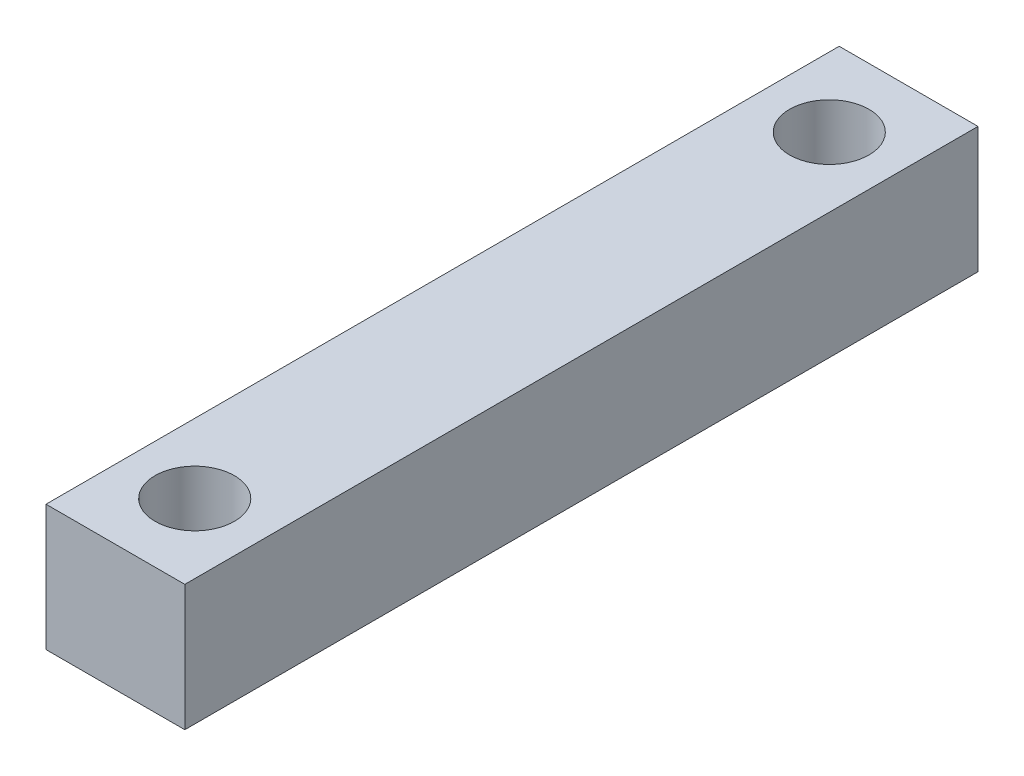
ISO-10303-21;
HEADER;
FILE_DESCRIPTION(('STEP AP214'),'2;1');
FILE_NAME('part.step','',(''),(''),'','','');
FILE_SCHEMA(('AUTOMOTIVE_DESIGN { 1 0 10303 214 1 1 1 1 }'));
ENDSEC;
DATA;
#1=APPLICATION_CONTEXT('core data for automotive mechanical design processes');
#2=APPLICATION_PROTOCOL_DEFINITION('international standard','automotive_design',2000,#1);
#3=PRODUCT_CONTEXT('',#1,'mechanical');
#4=PRODUCT('Part','Part','',(#3));
#5=PRODUCT_RELATED_PRODUCT_CATEGORY('part','',(#4));
#6=PRODUCT_DEFINITION_FORMATION('','',#4);
#7=PRODUCT_DEFINITION_CONTEXT('part definition',#1,'design');
#8=PRODUCT_DEFINITION('design','',#6,#7);
#9=PRODUCT_DEFINITION_SHAPE('','',#8);
#10=(LENGTH_UNIT() NAMED_UNIT(*) SI_UNIT(.MILLI.,.METRE.));
#11=(NAMED_UNIT(*) PLANE_ANGLE_UNIT() SI_UNIT($,.RADIAN.));
#12=(NAMED_UNIT(*) SI_UNIT($,.STERADIAN.) SOLID_ANGLE_UNIT());
#13=UNCERTAINTY_MEASURE_WITH_UNIT(LENGTH_MEASURE(1.E-05),#10,'distance_accuracy_value','');
#14=(GEOMETRIC_REPRESENTATION_CONTEXT(3) GLOBAL_UNCERTAINTY_ASSIGNED_CONTEXT((#13)) GLOBAL_UNIT_ASSIGNED_CONTEXT((#10,
#11,#12)) REPRESENTATION_CONTEXT('',''));
#15=CARTESIAN_POINT('',(0.,0.,0.));
#16=DIRECTION('',(0.,0.,1.));
#17=DIRECTION('',(1.,0.,0.));
#18=AXIS2_PLACEMENT_3D('',#15,#16,#17);
#19=CARTESIAN_POINT('',(3.5,3.175,-20.));
#20=DIRECTION('',(-1.,0.,0.));
#21=DIRECTION('',(0.,0.,1.));
#22=AXIS2_PLACEMENT_3D('',#19,#20,#21);
#23=PLANE('',#22);
#24=DIRECTION('',(0.,0.,-1.));
#25=VECTOR('',#24,1.);
#26=CARTESIAN_POINT('',(3.5,0.,-20.));
#27=LINE('',#26,#25);
#28=CARTESIAN_POINT('',(3.5,0.,20.));
#29=VERTEX_POINT('',#28);
#30=CARTESIAN_POINT('',(3.5,0.,-20.));
#31=VERTEX_POINT('',#30);
#32=EDGE_CURVE('E100',#29,#31,#27,.T.);
#33=ORIENTED_EDGE('',*,*,#32,.T.);
#34=DIRECTION('',(0.,-1.,0.));
#35=VECTOR('',#34,1.);
#36=CARTESIAN_POINT('',(3.5,3.175,-20.));
#37=LINE('',#36,#35);
#38=CARTESIAN_POINT('',(3.5,6.35,-20.));
#39=VERTEX_POINT('',#38);
#40=EDGE_CURVE('E11',#39,#31,#37,.T.);
#41=ORIENTED_EDGE('',*,*,#40,.F.);
#42=DIRECTION('',(0.,0.,-1.));
#43=VECTOR('',#42,1.);
#44=CARTESIAN_POINT('',(3.5,6.35,-20.));
#45=LINE('',#44,#43);
#46=CARTESIAN_POINT('',(3.5,6.35,20.));
#47=VERTEX_POINT('',#46);
#48=EDGE_CURVE('E84',#47,#39,#45,.T.);
#49=ORIENTED_EDGE('',*,*,#48,.F.);
#50=DIRECTION('',(0.,-1.,0.));
#51=VECTOR('',#50,1.);
#52=CARTESIAN_POINT('',(3.5,3.175,20.));
#53=LINE('',#52,#51);
#54=EDGE_CURVE('E76',#47,#29,#53,.T.);
#55=ORIENTED_EDGE('',*,*,#54,.T.);
#56=EDGE_LOOP('',(#33,#41,#49,#55));
#57=FACE_BOUND('',#56,.T.);
#58=ADVANCED_FACE('F32',(#57),#23,.F.);
#59=CARTESIAN_POINT('',(-3.5,3.175,-20.));
#60=DIRECTION('',(0.,0.,1.));
#61=DIRECTION('',(1.,0.,0.));
#62=AXIS2_PLACEMENT_3D('',#59,#60,#61);
#63=PLANE('',#62);
#64=DIRECTION('',(-1.,0.,0.));
#65=VECTOR('',#64,1.);
#66=CARTESIAN_POINT('',(-3.5,0.,-20.));
#67=LINE('',#66,#65);
#68=CARTESIAN_POINT('',(-3.5,0.,-20.));
#69=VERTEX_POINT('',#68);
#70=EDGE_CURVE('E103',#31,#69,#67,.T.);
#71=ORIENTED_EDGE('',*,*,#70,.T.);
#72=DIRECTION('',(0.,-1.,0.));
#73=VECTOR('',#72,1.);
#74=CARTESIAN_POINT('',(-3.5,3.175,-20.));
#75=LINE('',#74,#73);
#76=CARTESIAN_POINT('',(-3.5,6.35,-20.));
#77=VERTEX_POINT('',#76);
#78=EDGE_CURVE('E39',#77,#69,#75,.T.);
#79=ORIENTED_EDGE('',*,*,#78,.F.);
#80=DIRECTION('',(-1.,0.,0.));
#81=VECTOR('',#80,1.);
#82=CARTESIAN_POINT('',(-3.5,6.35,-20.));
#83=LINE('',#82,#81);
#84=EDGE_CURVE('E90',#39,#77,#83,.T.);
#85=ORIENTED_EDGE('',*,*,#84,.F.);
#86=ORIENTED_EDGE('',*,*,#40,.T.);
#87=EDGE_LOOP('',(#71,#79,#85,#86));
#88=FACE_BOUND('',#87,.T.);
#89=ADVANCED_FACE('F112',(#88),#63,.F.);
#90=CARTESIAN_POINT('',(-3.5,3.175,-20.));
#91=DIRECTION('',(1.,0.,0.));
#92=DIRECTION('',(0.,0.,-1.));
#93=AXIS2_PLACEMENT_3D('',#90,#91,#92);
#94=PLANE('',#93);
#95=DIRECTION('',(0.,0.,1.));
#96=VECTOR('',#95,1.);
#97=CARTESIAN_POINT('',(-3.5,0.,-20.));
#98=LINE('',#97,#96);
#99=CARTESIAN_POINT('',(-3.5,0.,20.));
#100=VERTEX_POINT('',#99);
#101=EDGE_CURVE('E54',#69,#100,#98,.T.);
#102=ORIENTED_EDGE('',*,*,#101,.T.);
#103=DIRECTION('',(0.,-1.,0.));
#104=VECTOR('',#103,1.);
#105=CARTESIAN_POINT('',(-3.5,3.175,20.));
#106=LINE('',#105,#104);
#107=CARTESIAN_POINT('',(-3.5,6.35,20.));
#108=VERTEX_POINT('',#107);
#109=EDGE_CURVE('E71',#108,#100,#106,.T.);
#110=ORIENTED_EDGE('',*,*,#109,.F.);
#111=DIRECTION('',(0.,0.,1.));
#112=VECTOR('',#111,1.);
#113=CARTESIAN_POINT('',(-3.5,6.35,-20.));
#114=LINE('',#113,#112);
#115=EDGE_CURVE('E75',#77,#108,#114,.T.);
#116=ORIENTED_EDGE('',*,*,#115,.F.);
#117=ORIENTED_EDGE('',*,*,#78,.T.);
#118=EDGE_LOOP('',(#102,#110,#116,#117));
#119=FACE_BOUND('',#118,.T.);
#120=ADVANCED_FACE('F73',(#119),#94,.F.);
#121=CARTESIAN_POINT('',(-3.5,3.175,20.));
#122=DIRECTION('',(0.,0.,-1.));
#123=DIRECTION('',(-1.,0.,0.));
#124=AXIS2_PLACEMENT_3D('',#121,#122,#123);
#125=PLANE('',#124);
#126=DIRECTION('',(1.,0.,0.));
#127=VECTOR('',#126,1.);
#128=CARTESIAN_POINT('',(-3.5,0.,20.));
#129=LINE('',#128,#127);
#130=EDGE_CURVE('E46',#100,#29,#129,.T.);
#131=ORIENTED_EDGE('',*,*,#130,.T.);
#132=ORIENTED_EDGE('',*,*,#54,.F.);
#133=DIRECTION('',(1.,0.,0.));
#134=VECTOR('',#133,1.);
#135=CARTESIAN_POINT('',(-3.5,6.35,20.));
#136=LINE('',#135,#134);
#137=EDGE_CURVE('E79',#108,#47,#136,.T.);
#138=ORIENTED_EDGE('',*,*,#137,.F.);
#139=ORIENTED_EDGE('',*,*,#109,.T.);
#140=EDGE_LOOP('',(#131,#132,#138,#139));
#141=FACE_BOUND('',#140,.T.);
#142=ADVANCED_FACE('F80',(#141),#125,.F.);
#143=CARTESIAN_POINT('',(0.,0.,0.));
#144=DIRECTION('',(0.,1.,0.));
#145=DIRECTION('',(0.,0.,1.));
#146=AXIS2_PLACEMENT_3D('',#143,#144,#145);
#147=PLANE('',#146);
#148=ORIENTED_EDGE('',*,*,#32,.F.);
#149=ORIENTED_EDGE('',*,*,#130,.F.);
#150=ORIENTED_EDGE('',*,*,#101,.F.);
#151=ORIENTED_EDGE('',*,*,#70,.F.);
#152=EDGE_LOOP('',(#148,#149,#150,#151));
#153=FACE_BOUND('',#152,.T.);
#154=ADVANCED_FACE('F110',(#153),#147,.F.);
#155=CARTESIAN_POINT('',(0.,6.35,0.));
#156=DIRECTION('',(0.,1.,0.));
#157=DIRECTION('',(0.,0.,1.));
#158=AXIS2_PLACEMENT_3D('',#155,#156,#157);
#159=PLANE('',#158);
#160=CARTESIAN_POINT('',(0.,6.35,-16.));
#161=DIRECTION('',(0.,1.,0.));
#162=DIRECTION('',(0.,0.,1.));
#163=AXIS2_PLACEMENT_3D('',#160,#161,#162);
#164=CIRCLE('',#163,2.);
#165=CARTESIAN_POINT('',(0.,6.35,-14.));
#166=VERTEX_POINT('',#165);
#167=EDGE_CURVE('E91',#166,#166,#164,.T.);
#168=ORIENTED_EDGE('',*,*,#167,.F.);
#169=EDGE_LOOP('',(#168));
#170=FACE_BOUND('',#169,.T.);
#171=ORIENTED_EDGE('',*,*,#115,.T.);
#172=ORIENTED_EDGE('',*,*,#137,.T.);
#173=ORIENTED_EDGE('',*,*,#48,.T.);
#174=ORIENTED_EDGE('',*,*,#84,.T.);
#175=EDGE_LOOP('',(#171,#172,#173,#174));
#176=FACE_BOUND('',#175,.T.);
#177=CARTESIAN_POINT('',(0.,6.35,16.));
#178=DIRECTION('',(0.,1.,0.));
#179=DIRECTION('',(0.,0.,1.));
#180=AXIS2_PLACEMENT_3D('',#177,#178,#179);
#181=CIRCLE('',#180,2.);
#182=CARTESIAN_POINT('',(0.,6.35,18.));
#183=VERTEX_POINT('',#182);
#184=EDGE_CURVE('E144',#183,#183,#181,.T.);
#185=ORIENTED_EDGE('',*,*,#184,.F.);
#186=EDGE_LOOP('',(#185));
#187=FACE_BOUND('',#186,.T.);
#188=ADVANCED_FACE('F87',(#170,#176,#187),#159,.T.);
#189=CARTESIAN_POINT('',(0.,6.35,-16.));
#190=DIRECTION('',(0.,-1.,0.));
#191=DIRECTION('',(0.,0.,-1.));
#192=AXIS2_PLACEMENT_3D('',#189,#190,#191);
#193=CYLINDRICAL_SURFACE('',#192,2.);
#194=ORIENTED_EDGE('',*,*,#167,.T.);
#195=EDGE_LOOP('',(#194));
#196=FACE_BOUND('',#195,.T.);
#197=CARTESIAN_POINT('',(0.,3.175,-16.));
#198=DIRECTION('',(0.,1.,0.));
#199=DIRECTION('',(0.,0.,1.));
#200=AXIS2_PLACEMENT_3D('',#197,#198,#199);
#201=CIRCLE('',#200,2.);
#202=CARTESIAN_POINT('',(0.,3.175,-14.));
#203=VERTEX_POINT('',#202);
#204=EDGE_CURVE('E94',#203,#203,#201,.T.);
#205=ORIENTED_EDGE('',*,*,#204,.F.);
#206=EDGE_LOOP('',(#205));
#207=FACE_BOUND('',#206,.T.);
#208=ADVANCED_FACE('F132',(#196,#207),#193,.F.);
#209=CARTESIAN_POINT('',(0.,6.35,16.));
#210=DIRECTION('',(0.,-1.,0.));
#211=DIRECTION('',(0.,0.,-1.));
#212=AXIS2_PLACEMENT_3D('',#209,#210,#211);
#213=CYLINDRICAL_SURFACE('',#212,2.);
#214=ORIENTED_EDGE('',*,*,#184,.T.);
#215=EDGE_LOOP('',(#214));
#216=FACE_BOUND('',#215,.T.);
#217=CARTESIAN_POINT('',(0.,3.175,16.));
#218=DIRECTION('',(0.,1.,0.));
#219=DIRECTION('',(0.,0.,1.));
#220=AXIS2_PLACEMENT_3D('',#217,#218,#219);
#221=CIRCLE('',#220,2.);
#222=CARTESIAN_POINT('',(0.,3.175,18.));
#223=VERTEX_POINT('',#222);
#224=EDGE_CURVE('E147',#223,#223,#221,.T.);
#225=ORIENTED_EDGE('',*,*,#224,.F.);
#226=EDGE_LOOP('',(#225));
#227=FACE_BOUND('',#226,.T.);
#228=ADVANCED_FACE('F128',(#216,#227),#213,.F.);
#229=CARTESIAN_POINT('',(0.,3.175,0.));
#230=DIRECTION('',(0.,1.,0.));
#231=DIRECTION('',(0.,0.,1.));
#232=AXIS2_PLACEMENT_3D('',#229,#230,#231);
#233=PLANE('',#232);
#234=ORIENTED_EDGE('',*,*,#204,.T.);
#235=EDGE_LOOP('',(#234));
#236=FACE_BOUND('',#235,.T.);
#237=ADVANCED_FACE('F124',(#236),#233,.T.);
#238=ORIENTED_EDGE('',*,*,#224,.T.);
#239=EDGE_LOOP('',(#238));
#240=FACE_BOUND('',#239,.T.);
#241=ADVANCED_FACE('F127',(#240),#233,.T.);
#242=CLOSED_SHELL('',(#58,#89,#120,#142,#154,#188,#208,#228,#237,#241));
#243=MANIFOLD_SOLID_BREP('B2',#242);
#244=ADVANCED_BREP_SHAPE_REPRESENTATION('',(#18,#243),#14);
#245=SHAPE_DEFINITION_REPRESENTATION(#9,#244);
ENDSEC;
END-ISO-10303-21;
